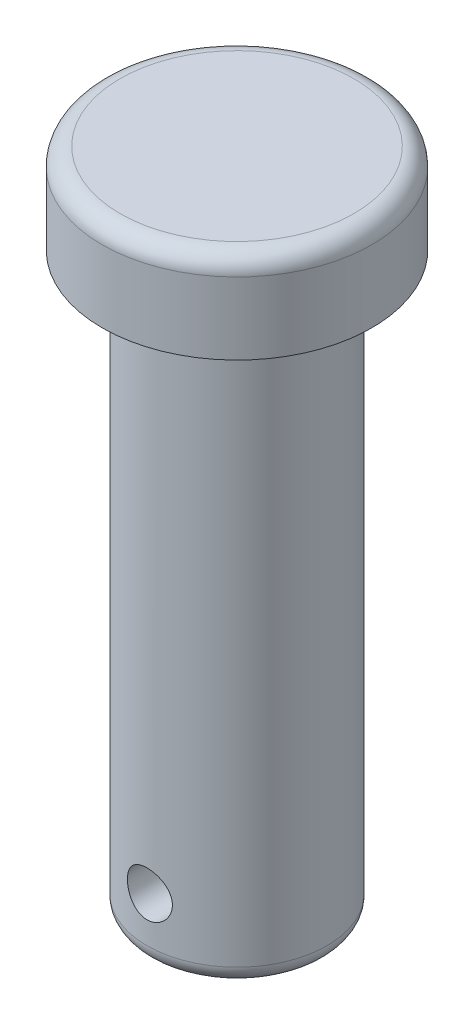
ISO-10303-21;
HEADER;
FILE_DESCRIPTION(('STEP AP214'),'2;1');
FILE_NAME('part.step','',(''),(''),'','','');
FILE_SCHEMA(('AUTOMOTIVE_DESIGN { 1 0 10303 214 1 1 1 1 }'));
ENDSEC;
DATA;
#1=APPLICATION_CONTEXT('core data for automotive mechanical design processes');
#2=APPLICATION_PROTOCOL_DEFINITION('international standard','automotive_design',2000,#1);
#3=PRODUCT_CONTEXT('',#1,'mechanical');
#4=PRODUCT('Part','Part','',(#3));
#5=PRODUCT_RELATED_PRODUCT_CATEGORY('part','',(#4));
#6=PRODUCT_DEFINITION_FORMATION('','',#4);
#7=PRODUCT_DEFINITION_CONTEXT('part definition',#1,'design');
#8=PRODUCT_DEFINITION('design','',#6,#7);
#9=PRODUCT_DEFINITION_SHAPE('','',#8);
#10=(LENGTH_UNIT() NAMED_UNIT(*) SI_UNIT(.MILLI.,.METRE.));
#11=(NAMED_UNIT(*) PLANE_ANGLE_UNIT() SI_UNIT($,.RADIAN.));
#12=(NAMED_UNIT(*) SI_UNIT($,.STERADIAN.) SOLID_ANGLE_UNIT());
#13=UNCERTAINTY_MEASURE_WITH_UNIT(LENGTH_MEASURE(1.E-05),#10,'distance_accuracy_value','');
#14=(GEOMETRIC_REPRESENTATION_CONTEXT(3) GLOBAL_UNCERTAINTY_ASSIGNED_CONTEXT((#13)) GLOBAL_UNIT_ASSIGNED_CONTEXT((#10,
#11,#12)) REPRESENTATION_CONTEXT('',''));
#15=CARTESIAN_POINT('',(0.,0.,0.));
#16=DIRECTION('',(0.,0.,1.));
#17=DIRECTION('',(1.,0.,0.));
#18=AXIS2_PLACEMENT_3D('',#15,#16,#17);
#19=CARTESIAN_POINT('',(0.,63.9999999999999,0.));
#20=DIRECTION('',(0.,-1.,0.));
#21=DIRECTION('',(0.,0.,-1.00000000000002));
#22=AXIS2_PLACEMENT_3D('',#19,#20,#21);
#23=CYLINDRICAL_SURFACE('',#22,10.);
#24=CARTESIAN_POINT('',(0.,2.,0.));
#25=DIRECTION('',(0.,1.,0.));
#26=DIRECTION('',(0.,0.,1.00000000000002));
#27=AXIS2_PLACEMENT_3D('',#24,#25,#26);
#28=CIRCLE('',#27,10.);
#29=CARTESIAN_POINT('',(0.,2.,10.0000000000002));
#30=VERTEX_POINT('',#29);
#31=EDGE_CURVE('E54',#30,#30,#28,.T.);
#32=ORIENTED_EDGE('',*,*,#31,.T.);
#33=EDGE_LOOP('',(#32));
#34=FACE_BOUND('',#33,.T.);
#35=CARTESIAN_POINT('',(0.,9.49999999999995,-10.));
#36=CARTESIAN_POINT('',(-0.138126814448933,9.49999612376977,-9.99999766446672));
#37=CARTESIAN_POINT('',(-0.276296929716727,9.48851408204412,-9.9971096355298));
#38=CARTESIAN_POINT('',(-0.54867720628164,9.44295808115521,-9.98586856383236));
#39=CARTESIAN_POINT('',(-0.682885078114544,9.40887131743654,-9.97751242366897));
#40=CARTESIAN_POINT('',(-0.94336812030097,9.31926791089655,-9.95626043887002));
#41=CARTESIAN_POINT('',(-1.06965260571408,9.26377700214204,-9.94337004736861));
#42=CARTESIAN_POINT('',(-1.31112021983965,9.1330310165931,-9.91442239679315));
#43=CARTESIAN_POINT('',(-1.42630297391433,9.05777527313577,-9.89836503090239));
#44=CARTESIAN_POINT('',(-1.64466987883516,8.88799868390883,-9.86445689319496));
#45=CARTESIAN_POINT('',(-1.74759281676848,8.79314737506623,-9.84657845246879));
#46=CARTESIAN_POINT('',(-1.93624821200862,8.58757965848353,-9.81122700196499));
#47=CARTESIAN_POINT('',(-2.02197872825505,8.47686146175547,-9.79375403816325));
#48=CARTESIAN_POINT('',(-2.17504423800405,8.24067462210565,-9.76091292830174));
#49=CARTESIAN_POINT('',(-2.24208702654379,8.11501128198463,-9.74557990774651));
#50=CARTESIAN_POINT('',(-2.35399484758363,7.8537526472319,-9.71915824696705));
#51=CARTESIAN_POINT('',(-2.39886342573361,7.71815894444613,-9.70806892824014));
#52=CARTESIAN_POINT('',(-2.46425806134146,7.44376083633066,-9.69167461160534));
#53=CARTESIAN_POINT('',(-2.48525378055272,7.30507517326983,-9.68625818328388));
#54=CARTESIAN_POINT('',(-2.50376962511142,7.0260523850007,-9.68148937432615));
#55=CARTESIAN_POINT('',(-2.50129356969996,6.88571553217946,-9.68213600713061));
#56=CARTESIAN_POINT('',(-2.47331087440267,6.61097365375792,-9.68932009194541));
#57=CARTESIAN_POINT('',(-2.44836390031865,6.47650729755836,-9.69571438345445));
#58=CARTESIAN_POINT('',(-2.37704031150438,6.21373158181552,-9.71344516118484));
#59=CARTESIAN_POINT('',(-2.3306621701157,6.08542266161874,-9.72478199948737));
#60=CARTESIAN_POINT('',(-2.21731579656236,5.8371033062464,-9.75125189842752));
#61=CARTESIAN_POINT('',(-2.15014444538828,5.71718971368402,-9.76642212449691));
#62=CARTESIAN_POINT('',(-1.9972604600248,5.49013548373864,-9.79882851409987));
#63=CARTESIAN_POINT('',(-1.91154458134807,5.38299708655459,-9.81606503891043));
#64=CARTESIAN_POINT('',(-1.72110570780217,5.18132730717606,-9.85126467566479));
#65=CARTESIAN_POINT('',(-1.61591043027658,5.08724251656454,-9.86923449129999));
#66=CARTESIAN_POINT('',(-1.39101986250632,4.9179645958936,-9.90343275964592));
#67=CARTESIAN_POINT('',(-1.27132412951339,4.8427720428941,-9.91966115915674));
#68=CARTESIAN_POINT('',(-1.02019314780241,4.71324902295933,-9.94862886823649));
#69=CARTESIAN_POINT('',(-0.88871898868106,4.65899109957592,-9.96135600212884));
#70=CARTESIAN_POINT('',(-0.618126680238141,4.57347115715076,-9.98179861652355));
#71=CARTESIAN_POINT('',(-0.479009998584199,4.54220473930323,-9.98951505565443));
#72=CARTESIAN_POINT('',(-0.200899950651536,4.50423739073534,-9.99892498785639));
#73=CARTESIAN_POINT('',(-0.0619945333165902,4.4969282898742,-10.0007675584721));
#74=CARTESIAN_POINT('',(0.215054791329902,4.50541500342585,-9.99864674690683));
#75=CARTESIAN_POINT('',(0.353198766066759,4.52120873799929,-9.9946838873614));
#76=CARTESIAN_POINT('',(0.62269044795354,4.57495151398547,-9.98149301878659));
#77=CARTESIAN_POINT('',(0.754108531609114,4.61256877246037,-9.97234390309604));
#78=CARTESIAN_POINT('',(1.00876215408522,4.70851180671244,-9.94981177723706));
#79=CARTESIAN_POINT('',(1.13199686505346,4.7668396738544,-9.93642833950013));
#80=CARTESIAN_POINT('',(1.3692052240501,4.90372688145857,-9.90655513210342));
#81=CARTESIAN_POINT('',(1.48297573639335,4.98262685399604,-9.8900144561096));
#82=CARTESIAN_POINT('',(1.69587768940865,5.15798318132977,-9.85574181979568));
#83=CARTESIAN_POINT('',(1.79500659829459,5.25444256602897,-9.83800965421593));
#84=CARTESIAN_POINT('',(1.97831761345956,5.46500326807233,-9.80281594932501));
#85=CARTESIAN_POINT('',(2.06207311270418,5.57947950500023,-9.78537173637418));
#86=CARTESIAN_POINT('',(2.20918459835526,5.82122105744924,-9.7532146397008));
#87=CARTESIAN_POINT('',(2.27254149026815,5.94848580495152,-9.73850163475056));
#88=CARTESIAN_POINT('',(2.37658570101224,6.21150953734353,-9.71363491194772));
#89=CARTESIAN_POINT('',(2.41740732774015,6.34721271385351,-9.70345425375806));
#90=CARTESIAN_POINT('',(2.47557609990394,6.62384939642525,-9.6887790670659));
#91=CARTESIAN_POINT('',(2.49292837912296,6.76478175170237,-9.68428329504166));
#92=CARTESIAN_POINT('',(2.50339765055731,7.0435350397694,-9.68158168701761));
#93=CARTESIAN_POINT('',(2.49719649630031,7.18132905854404,-9.683198878881));
#94=CARTESIAN_POINT('',(2.46229546385467,7.45383981444383,-9.69213181672077));
#95=CARTESIAN_POINT('',(2.43359603781148,7.58855661335554,-9.69944744817619));
#96=CARTESIAN_POINT('',(2.35488553240454,7.85034743177575,-9.71885434473164));
#97=CARTESIAN_POINT('',(2.30500234113329,7.97746217539881,-9.73091692061099));
#98=CARTESIAN_POINT('',(2.18544152267722,8.22160897118812,-9.75846259540764));
#99=CARTESIAN_POINT('',(2.11576115006242,8.33863962197862,-9.77394616867515));
#100=CARTESIAN_POINT('',(1.95644624773465,8.56259104833726,-9.80709390439018));
#101=CARTESIAN_POINT('',(1.86633860485684,8.66916845570524,-9.82480441386188));
#102=CARTESIAN_POINT('',(1.66964895198316,8.8659117413237,-9.86013378743823));
#103=CARTESIAN_POINT('',(1.56306303543567,8.95607371685423,-9.87775262878438));
#104=CARTESIAN_POINT('',(1.33411264450458,9.11901884760798,-9.91129426079435));
#105=CARTESIAN_POINT('',(1.2114973705273,9.19145768945276,-9.92718055609778));
#106=CARTESIAN_POINT('',(0.955443432517323,9.31457910490085,-9.95508208291867));
#107=CARTESIAN_POINT('',(0.822012605727917,9.36527726774755,-9.96710008666311));
#108=CARTESIAN_POINT('',(0.57401708873927,9.43595305054945,-9.9841343260924));
#109=CARTESIAN_POINT('',(0.460633618180256,9.45991873842241,-9.99004308421148));
#110=CARTESIAN_POINT('',(0.231510119227234,9.49194323936986,-9.99797675386583));
#111=CARTESIAN_POINT('',(0.115770268737751,9.50000324884205,-10.000001957515));
#112=CARTESIAN_POINT('',(0.,9.49999999999995,-10.));
#113=B_SPLINE_CURVE_WITH_KNOTS('',3,(#35,#36,#37,#38,#39,#40,#41,#42,#43,#44,#45,#46,#47,#48,
#49,#50,#51,#52,#53,#54,#55,#56,#57,#58,#59,#60,#61,#62,#63,#64,#65,#66,#67,#68,#69,#70,#71,#72,
#73,#74,#75,#76,#77,#78,#79,#80,#81,#82,#83,#84,#85,#86,#87,#88,#89,#90,#91,#92,#93,#94,#95,#96,
#97,#98,#99,#100,#101,#102,#103,#104,#105,#106,#107,#108,#109,#110,#111,#112),.UNSPECIFIED.,.T.,
.F.,(4,2,2,2,2,2,2,2,2,2,2,2,2,2,2,2,2,2,2,2,2,2,2,2,2,2,2,2,2,2,2,2,2,2,2,2,2,2,4),(0.,
0.413956187451264,0.828147062935845,1.24184150380788,1.6555499002821,2.07690725728799,
2.49831215967163,2.92597745909858,3.35357435282357,3.77260491835241,4.19156730193435,
4.60037495017295,5.00921172449058,5.42217546462149,5.8352115139927,6.26002501620684,
6.68485149269408,7.11113715020868,7.53734122820074,7.95263848254025,8.36789835192716,
8.77700457528614,9.18615212209452,9.60255979281458,10.0190393835277,10.4457418201331,
10.8724253125486,11.2965375769777,11.7205570543059,12.1323963400758,12.5442273493662,
12.9536066760882,13.3630428023772,13.7831596069292,14.2033761629401,14.6312030917598,
15.0587227304556,15.4057040491355,15.7526592674838),.UNSPECIFIED.);
#114=CARTESIAN_POINT('',(0.,9.49999999999995,-10.));
#115=VERTEX_POINT('',#114);
#116=EDGE_CURVE('E74',#115,#115,#113,.T.);
#117=ORIENTED_EDGE('',*,*,#116,.T.);
#118=EDGE_LOOP('',(#117));
#119=FACE_BOUND('',#118,.T.);
#120=CARTESIAN_POINT('',(2.5000000000015,7.00000000000001,9.68245836551895));
#121=CARTESIAN_POINT('',(2.49999607859507,6.86194924907309,9.68246100087915));
#122=CARTESIAN_POINT('',(2.48852624550061,6.72385510132054,9.68544306014593));
#123=CARTESIAN_POINT('',(2.44302312546064,6.45163242182625,9.69701861992572));
#124=CARTESIAN_POINT('',(2.40897670673176,6.31750624553289,9.70561538621714));
#125=CARTESIAN_POINT('',(2.31949119962116,6.05719646181295,9.72738724596259));
#126=CARTESIAN_POINT('',(2.26407972785046,5.93100284461211,9.74055642690513));
#127=CARTESIAN_POINT('',(2.13352114126274,5.68968914745735,9.76998192028763));
#128=CARTESIAN_POINT('',(2.05837318856068,5.57456953791871,9.78623836378496));
#129=CARTESIAN_POINT('',(1.88870842731124,5.35613835473824,9.82040716355626));
#130=CARTESIAN_POINT('',(1.79383688770409,5.25310639965032,9.83834597623029));
#131=CARTESIAN_POINT('',(1.58818206410117,5.06423860563979,9.87362875515289));
#132=CARTESIAN_POINT('',(1.47739729418056,4.97840437437829,9.89097266566391));
#133=CARTESIAN_POINT('',(1.24114520107889,4.82522453236867,9.92340415520589));
#134=CARTESIAN_POINT('',(1.11549457619502,4.75815361183848,9.93845687400597));
#135=CARTESIAN_POINT('',(0.854263184292674,4.64619035584689,9.96430811925981));
#136=CARTESIAN_POINT('',(0.718683885791924,4.60129474808448,9.97510727334338));
#137=CARTESIAN_POINT('',(0.444358758754195,4.53585216542141,9.99104758848173));
#138=CARTESIAN_POINT('',(0.305732719548981,4.51483035567342,9.9962989384431));
#139=CARTESIAN_POINT('',(0.0268288192627251,4.49624162072446,10.000935941073));
#140=CARTESIAN_POINT('',(-0.113448794538135,4.49867122779041,10.0003224609671));
#141=CARTESIAN_POINT('',(-0.388380617930917,4.5265748502502,9.99338094953539));
#142=CARTESIAN_POINT('',(-0.523090539002478,4.55153632505393,9.9871800234087));
#143=CARTESIAN_POINT('',(-0.786345618534154,4.62297127004837,9.96990836524859));
#144=CARTESIAN_POINT('',(-0.914890448426292,4.66944588537707,9.95883737398464));
#145=CARTESIAN_POINT('',(-1.16351675875531,4.7830025706878,9.93287509700878));
#146=CARTESIAN_POINT('',(-1.2835112744173,4.85026704466393,9.91795019694973));
#147=CARTESIAN_POINT('',(-1.51068905585562,5.00335567911776,9.88589903809652));
#148=CARTESIAN_POINT('',(-1.61787008772129,5.08918306855996,9.86877239652639));
#149=CARTESIAN_POINT('',(-1.81943508771924,5.27970874198175,9.8336371376935));
#150=CARTESIAN_POINT('',(-1.9133941976911,5.38485489234928,9.81561719525266));
#151=CARTESIAN_POINT('',(-2.08244093990731,5.60959997354259,9.78115043517299));
#152=CARTESIAN_POINT('',(-2.15752769011517,5.72919957949207,9.76470369108289));
#153=CARTESIAN_POINT('',(-2.28697032255687,5.98029003414863,9.73520496829307));
#154=CARTESIAN_POINT('',(-2.34122391742635,6.11183573031278,9.72216983716957));
#155=CARTESIAN_POINT('',(-2.42671405159075,6.38258546807699,9.70118640148718));
#156=CARTESIAN_POINT('',(-2.45795551638223,6.52178786398468,9.69323700842919));
#157=CARTESIAN_POINT('',(-2.49582963866552,6.79995950152987,9.68355356007639));
#158=CARTESIAN_POINT('',(-2.50309047391895,6.9388377933409,9.68166088976982));
#159=CARTESIAN_POINT('',(-2.49451699051533,7.21582193658517,9.68387343364643));
#160=CARTESIAN_POINT('',(-2.47868479785008,7.35392785794946,9.68797809570287));
#161=CARTESIAN_POINT('',(-2.42492546393832,7.62311426494847,9.70157081984993));
#162=CARTESIAN_POINT('',(-2.38736406828169,7.75427272656888,9.71096970242535));
#163=CARTESIAN_POINT('',(-2.29161808167087,8.00843145785311,9.73400718262796));
#164=CARTESIAN_POINT('',(-2.23343104771382,8.13143075905588,9.74764628246396));
#165=CARTESIAN_POINT('',(-2.09677066793807,8.36844127786697,9.77796137095499));
#166=CARTESIAN_POINT('',(-2.01792175383629,8.48222884004268,9.79469168607236));
#167=CARTESIAN_POINT('',(-1.84265073233605,8.69518836280108,9.82917083071111));
#168=CARTESIAN_POINT('',(-1.74622573701361,8.79435791665,9.84691982728308));
#169=CARTESIAN_POINT('',(-1.53565680246184,8.97781104257103,9.88197403031777));
#170=CARTESIAN_POINT('',(-1.42112988132892,9.06166006254886,9.89925702061882));
#171=CARTESIAN_POINT('',(-1.17925670673663,9.20893586695127,9.93097216613689));
#172=CARTESIAN_POINT('',(-1.051911122394,9.27236371660826,9.9454044700395));
#173=CARTESIAN_POINT('',(-0.788895504327843,9.37644603452794,9.96970115738327));
#174=CARTESIAN_POINT('',(-0.65329345256983,9.41726428437901,9.97959830022411));
#175=CARTESIAN_POINT('',(-0.376874400797095,9.47546033460843,9.99385293395785));
#176=CARTESIAN_POINT('',(-0.236058412603122,9.49284265873918,9.99821149393412));
#177=CARTESIAN_POINT('',(0.042708816109199,9.50341897393882,10.0008542352202));
#178=CARTESIAN_POINT('',(0.180634567416807,9.49725427273808,9.99929947200001));
#179=CARTESIAN_POINT('',(0.453418741040449,9.46238043176391,9.99064741143561));
#180=CARTESIAN_POINT('',(0.588277254456854,9.43367196246752,9.98355027892777));
#181=CARTESIAN_POINT('',(0.850427589116146,9.35486945057282,9.96463582134568));
#182=CARTESIAN_POINT('',(0.977756236455173,9.30489136671318,9.95284411255921));
#183=CARTESIAN_POINT('',(1.22229263260521,9.18507355244992,9.92578222284159));
#184=CARTESIAN_POINT('',(1.33949910316456,9.11523131832319,9.91051160346887));
#185=CARTESIAN_POINT('',(1.56350482105832,8.95571191500967,9.87768124200699));
#186=CARTESIAN_POINT('',(1.66998747074608,8.86559964274034,9.86007542354151));
#187=CARTESIAN_POINT('',(1.86653755068384,8.66894287005642,9.82476622642979));
#188=CARTESIAN_POINT('',(1.95660081269123,8.56239420972186,9.80706282418266));
#189=CARTESIAN_POINT('',(2.11940506617948,8.33349646452673,9.77318689613742));
#190=CARTESIAN_POINT('',(2.19179154854137,8.21088969158793,9.75704909183177));
#191=CARTESIAN_POINT('',(2.31481724146234,7.95486127531383,9.72859888737135));
#192=CARTESIAN_POINT('',(2.36547227437671,7.82144758476537,9.71628370583242));
#193=CARTESIAN_POINT('',(2.43605632142448,7.57355747041168,9.69879771877005));
#194=CARTESIAN_POINT('',(2.45998292649121,7.46026708903442,9.69271657508779));
#195=CARTESIAN_POINT('',(2.49195573143046,7.2313278275058,9.68454596456517));
#196=CARTESIAN_POINT('',(2.50000328593046,7.1156791493891,9.68245615722799));
#197=CARTESIAN_POINT('',(2.5000000000015,7.00000000000001,9.68245836551895));
#198=B_SPLINE_CURVE_WITH_KNOTS('',3,(#120,#121,#122,#123,#124,#125,#126,#127,#128,#129,#130,
#131,#132,#133,#134,#135,#136,#137,#138,#139,#140,#141,#142,#143,#144,#145,#146,#147,#148,#149,
#150,#151,#152,#153,#154,#155,#156,#157,#158,#159,#160,#161,#162,#163,#164,#165,#166,#167,#168,
#169,#170,#171,#172,#173,#174,#175,#176,#177,#178,#179,#180,#181,#182,#183,#184,#185,#186,#187,
#188,#189,#190,#191,#192,#193,#194,#195,#196,#197),.UNSPECIFIED.,.T.,.F.,(4,2,2,2,2,2,2,2,2,2,2,
2,2,2,2,2,2,2,2,2,2,2,2,2,2,2,2,2,2,2,2,2,2,2,2,2,2,2,4),(0.,0.413727441736508,
0.827695741431488,1.24113072716756,1.65458326755322,2.07623954192761,2.49793521479707,
2.92551496397779,3.35303159846927,3.77188750995191,4.19068148665868,4.60018262688768,
5.00970556724626,5.42292874254628,5.83622385469367,6.26070466572071,6.6852053119974,
7.11176432008348,7.53823200129457,7.95343574764108,8.36860127188664,8.77697405014046,
9.18539521426217,9.60182845863995,10.0183301888994,10.4452533097021,10.8721541572443,
11.295920728118,11.7196054891393,12.1318344613262,12.5440511738238,12.9540487656484,
13.3640980574297,13.7839709658701,14.2039503157041,14.6317647729096,15.0592672137484,
15.4059782718566,15.7526597510783),.UNSPECIFIED.);
#199=CARTESIAN_POINT('',(2.5000000000015,7.00000000000001,9.68245836551895));
#200=VERTEX_POINT('',#199);
#201=EDGE_CURVE('E82',#200,#200,#198,.T.);
#202=ORIENTED_EDGE('',*,*,#201,.T.);
#203=EDGE_LOOP('',(#202));
#204=FACE_BOUND('',#203,.T.);
#205=CARTESIAN_POINT('',(0.,63.9999999999999,0.));
#206=DIRECTION('',(0.,1.,0.));
#207=DIRECTION('',(0.,0.,1.00000000000002));
#208=AXIS2_PLACEMENT_3D('',#205,#206,#207);
#209=CIRCLE('',#208,10.);
#210=CARTESIAN_POINT('',(0.,63.9999999999999,10.0000000000002));
#211=VERTEX_POINT('',#210);
#212=EDGE_CURVE('E71',#211,#211,#209,.T.);
#213=ORIENTED_EDGE('',*,*,#212,.F.);
#214=EDGE_LOOP('',(#213));
#215=FACE_BOUND('',#214,.T.);
#216=ADVANCED_FACE('F50',(#34,#119,#204,#215),#23,.T.);
#217=CARTESIAN_POINT('',(0.,0.,0.));
#218=DIRECTION('',(0.,1.,0.));
#219=DIRECTION('',(0.,0.,1.00000000000002));
#220=AXIS2_PLACEMENT_3D('',#217,#218,#219);
#221=PLANE('',#220);
#222=CARTESIAN_POINT('',(0.,0.,0.));
#223=DIRECTION('',(0.,1.,0.));
#224=DIRECTION('',(0.,0.,1.00000000000002));
#225=AXIS2_PLACEMENT_3D('',#222,#223,#224);
#226=CIRCLE('',#225,8.);
#227=CARTESIAN_POINT('',(0.,0.,8.00000000000017));
#228=VERTEX_POINT('',#227);
#229=EDGE_CURVE('E11',#228,#228,#226,.F.);
#230=ORIENTED_EDGE('',*,*,#229,.T.);
#231=EDGE_LOOP('',(#230));
#232=FACE_BOUND('',#231,.T.);
#233=ADVANCED_FACE('F107',(#232),#221,.F.);
#234=CARTESIAN_POINT('',(0.,74.,0.));
#235=DIRECTION('',(0.,-1.,0.));
#236=DIRECTION('',(0.,0.,-1.00000000000002));
#237=AXIS2_PLACEMENT_3D('',#234,#235,#236);
#238=CYLINDRICAL_SURFACE('',#237,15.);
#239=CARTESIAN_POINT('',(0.,72.,0.));
#240=DIRECTION('',(0.,1.,0.));
#241=DIRECTION('',(0.,0.,1.00000000000002));
#242=AXIS2_PLACEMENT_3D('',#239,#240,#241);
#243=CIRCLE('',#242,15.);
#244=CARTESIAN_POINT('',(0.,72.,15.0000000000003));
#245=VERTEX_POINT('',#244);
#246=EDGE_CURVE('E61',#245,#245,#243,.F.);
#247=ORIENTED_EDGE('',*,*,#246,.T.);
#248=EDGE_LOOP('',(#247));
#249=FACE_BOUND('',#248,.T.);
#250=CARTESIAN_POINT('',(0.,63.9999999999999,0.));
#251=DIRECTION('',(0.,1.,0.));
#252=DIRECTION('',(0.,0.,1.00000000000002));
#253=AXIS2_PLACEMENT_3D('',#250,#251,#252);
#254=CIRCLE('',#253,15.);
#255=CARTESIAN_POINT('',(0.,63.9999999999999,15.0000000000003));
#256=VERTEX_POINT('',#255);
#257=EDGE_CURVE('E81',#256,#256,#254,.T.);
#258=ORIENTED_EDGE('',*,*,#257,.T.);
#259=EDGE_LOOP('',(#258));
#260=FACE_BOUND('',#259,.T.);
#261=ADVANCED_FACE('F105',(#249,#260),#238,.T.);
#262=CARTESIAN_POINT('',(0.,74.,0.));
#263=DIRECTION('',(0.,1.,0.));
#264=DIRECTION('',(0.,0.,1.00000000000002));
#265=AXIS2_PLACEMENT_3D('',#262,#263,#264);
#266=PLANE('',#265);
#267=CARTESIAN_POINT('',(0.,74.,0.));
#268=DIRECTION('',(0.,1.,0.));
#269=DIRECTION('',(0.,0.,1.00000000000002));
#270=AXIS2_PLACEMENT_3D('',#267,#268,#269);
#271=CIRCLE('',#270,13.);
#272=CARTESIAN_POINT('',(0.,74.,13.0000000000003));
#273=VERTEX_POINT('',#272);
#274=EDGE_CURVE('E70',#273,#273,#271,.T.);
#275=ORIENTED_EDGE('',*,*,#274,.T.);
#276=EDGE_LOOP('',(#275));
#277=FACE_BOUND('',#276,.T.);
#278=ADVANCED_FACE('F98',(#277),#266,.T.);
#279=CARTESIAN_POINT('',(0.,63.9999999999999,0.));
#280=DIRECTION('',(0.,1.,0.));
#281=DIRECTION('',(0.,0.,1.00000000000002));
#282=AXIS2_PLACEMENT_3D('',#279,#280,#281);
#283=PLANE('',#282);
#284=ORIENTED_EDGE('',*,*,#212,.T.);
#285=EDGE_LOOP('',(#284));
#286=FACE_BOUND('',#285,.T.);
#287=ORIENTED_EDGE('',*,*,#257,.F.);
#288=EDGE_LOOP('',(#287));
#289=FACE_BOUND('',#288,.T.);
#290=ADVANCED_FACE('F96',(#286,#289),#283,.F.);
#291=CARTESIAN_POINT('',(0.,7.00000000000001,-15.));
#292=DIRECTION('',(0.,0.,1.00000000000002));
#293=DIRECTION('',(1.00000000000002,0.,0.));
#294=AXIS2_PLACEMENT_3D('',#291,#292,#293);
#295=CYLINDRICAL_SURFACE('',#294,2.5);
#296=ORIENTED_EDGE('',*,*,#201,.F.);
#297=EDGE_LOOP('',(#296));
#298=FACE_BOUND('',#297,.T.);
#299=ORIENTED_EDGE('',*,*,#116,.F.);
#300=EDGE_LOOP('',(#299));
#301=FACE_BOUND('',#300,.T.);
#302=ADVANCED_FACE('F93',(#298,#301),#295,.F.);
#303=CARTESIAN_POINT('',(0.,72.,0.));
#304=DIRECTION('',(0.,1.,0.));
#305=DIRECTION('',(0.,0.,1.00000000000002));
#306=AXIS2_PLACEMENT_3D('',#303,#304,#305);
#307=TOROIDAL_SURFACE('',#306,13.,2.);
#308=ORIENTED_EDGE('',*,*,#246,.F.);
#309=EDGE_LOOP('',(#308));
#310=FACE_BOUND('',#309,.T.);
#311=ORIENTED_EDGE('',*,*,#274,.F.);
#312=EDGE_LOOP('',(#311));
#313=FACE_BOUND('',#312,.T.);
#314=ADVANCED_FACE('F92',(#310,#313),#307,.T.);
#315=CARTESIAN_POINT('',(0.,2.,0.));
#316=DIRECTION('',(0.,1.,0.));
#317=DIRECTION('',(0.,0.,1.00000000000002));
#318=AXIS2_PLACEMENT_3D('',#315,#316,#317);
#319=TOROIDAL_SURFACE('',#318,8.,2.);
#320=ORIENTED_EDGE('',*,*,#229,.F.);
#321=EDGE_LOOP('',(#320));
#322=FACE_BOUND('',#321,.T.);
#323=ORIENTED_EDGE('',*,*,#31,.F.);
#324=EDGE_LOOP('',(#323));
#325=FACE_BOUND('',#324,.T.);
#326=ADVANCED_FACE('F47',(#322,#325),#319,.T.);
#327=CLOSED_SHELL('',(#216,#233,#261,#278,#290,#302,#314,#326));
#328=MANIFOLD_SOLID_BREP('B2',#327);
#329=ADVANCED_BREP_SHAPE_REPRESENTATION('',(#18,#328),#14);
#330=SHAPE_DEFINITION_REPRESENTATION(#9,#329);
ENDSEC;
END-ISO-10303-21;
